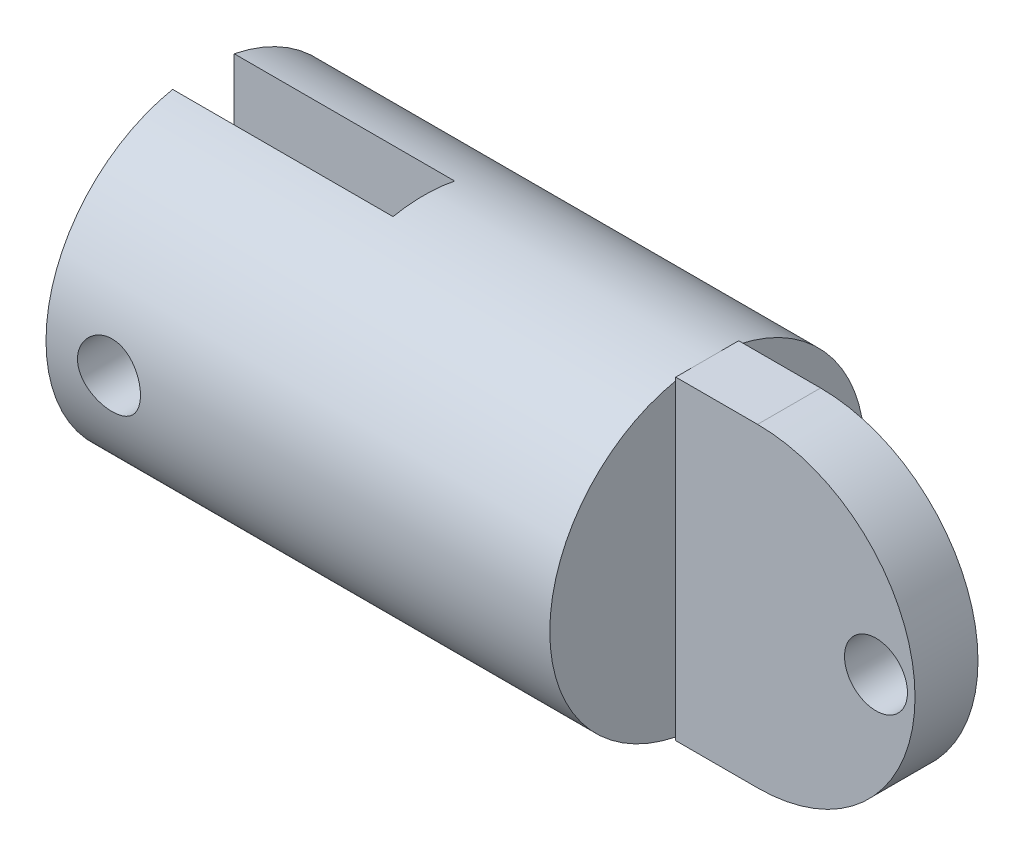
ISO-10303-21;
HEADER;
FILE_DESCRIPTION(('STEP AP214'),'2;1');
FILE_NAME('part.step','',(''),(''),'','','');
FILE_SCHEMA(('AUTOMOTIVE_DESIGN { 1 0 10303 214 1 1 1 1 }'));
ENDSEC;
DATA;
#1=APPLICATION_CONTEXT('core data for automotive mechanical design processes');
#2=APPLICATION_PROTOCOL_DEFINITION('international standard','automotive_design',2000,#1);
#3=PRODUCT_CONTEXT('',#1,'mechanical');
#4=PRODUCT('Part','Part','',(#3));
#5=PRODUCT_RELATED_PRODUCT_CATEGORY('part','',(#4));
#6=PRODUCT_DEFINITION_FORMATION('','',#4);
#7=PRODUCT_DEFINITION_CONTEXT('part definition',#1,'design');
#8=PRODUCT_DEFINITION('design','',#6,#7);
#9=PRODUCT_DEFINITION_SHAPE('','',#8);
#10=(LENGTH_UNIT() NAMED_UNIT(*) SI_UNIT(.MILLI.,.METRE.));
#11=(NAMED_UNIT(*) PLANE_ANGLE_UNIT() SI_UNIT($,.RADIAN.));
#12=(NAMED_UNIT(*) SI_UNIT($,.STERADIAN.) SOLID_ANGLE_UNIT());
#13=UNCERTAINTY_MEASURE_WITH_UNIT(LENGTH_MEASURE(1.E-05),#10,'distance_accuracy_value','');
#14=(GEOMETRIC_REPRESENTATION_CONTEXT(3) GLOBAL_UNCERTAINTY_ASSIGNED_CONTEXT((#13)) GLOBAL_UNIT_ASSIGNED_CONTEXT((#10,
#11,#12)) REPRESENTATION_CONTEXT('',''));
#15=CARTESIAN_POINT('',(0.,0.,0.));
#16=DIRECTION('',(0.,0.,1.));
#17=DIRECTION('',(1.,0.,0.));
#18=AXIS2_PLACEMENT_3D('',#15,#16,#17);
#19=CARTESIAN_POINT('',(-40.,0.,0.));
#20=DIRECTION('',(1.,0.,0.));
#21=DIRECTION('',(0.,0.,-1.));
#22=AXIS2_PLACEMENT_3D('',#19,#20,#21);
#23=PLANE('',#22);
#24=CARTESIAN_POINT('',(-40.,0.,0.));
#25=DIRECTION('',(1.,0.,0.));
#26=DIRECTION('',(0.,0.,-1.));
#27=AXIS2_PLACEMENT_3D('',#24,#25,#26);
#28=CIRCLE('',#27,12.5);
#29=CARTESIAN_POINT('',(-40.,12.2581864188566,2.44680725038947));
#30=VERTEX_POINT('',#29);
#31=CARTESIAN_POINT('',(-40.,-12.2581864188566,2.44680725038947));
#32=VERTEX_POINT('',#31);
#33=EDGE_CURVE('E154',#30,#32,#28,.T.);
#34=ORIENTED_EDGE('',*,*,#33,.F.);
#35=DIRECTION('',(0.,-1.,0.));
#36=VECTOR('',#35,1.);
#37=CARTESIAN_POINT('',(-40.,0.,2.44680725038947));
#38=LINE('',#37,#36);
#39=EDGE_CURVE('E143',#30,#32,#38,.T.);
#40=ORIENTED_EDGE('',*,*,#39,.T.);
#41=EDGE_LOOP('',(#34,#40));
#42=FACE_BOUND('',#41,.T.);
#43=ADVANCED_FACE('F50',(#42),#23,.F.);
#44=CARTESIAN_POINT('',(0.,0.,0.));
#45=DIRECTION('',(1.,0.,0.));
#46=DIRECTION('',(0.,0.,-1.));
#47=AXIS2_PLACEMENT_3D('',#44,#45,#46);
#48=PLANE('',#47);
#49=DIRECTION('',(0.,1.,0.));
#50=VECTOR('',#49,1.);
#51=CARTESIAN_POINT('',(0.,12.5,-2.5));
#52=LINE('',#51,#50);
#53=CARTESIAN_POINT('',(0.,-12.2474487139159,-2.5));
#54=VERTEX_POINT('',#53);
#55=CARTESIAN_POINT('',(0.,12.2474487139159,-2.5));
#56=VERTEX_POINT('',#55);
#57=EDGE_CURVE('E75',#54,#56,#52,.T.);
#58=ORIENTED_EDGE('',*,*,#57,.F.);
#59=CARTESIAN_POINT('',(0.,0.,0.));
#60=DIRECTION('',(1.,0.,0.));
#61=DIRECTION('',(0.,0.,-1.));
#62=AXIS2_PLACEMENT_3D('',#59,#60,#61);
#63=CIRCLE('',#62,12.5);
#64=EDGE_CURVE('E164',#54,#56,#63,.T.);
#65=ORIENTED_EDGE('',*,*,#64,.T.);
#66=EDGE_LOOP('',(#58,#65));
#67=FACE_BOUND('',#66,.T.);
#68=ADVANCED_FACE('F312',(#67),#48,.T.);
#69=CARTESIAN_POINT('',(-40.,0.,0.));
#70=DIRECTION('',(1.,0.,0.));
#71=DIRECTION('',(0.,0.,-1.));
#72=AXIS2_PLACEMENT_3D('',#69,#70,#71);
#73=CYLINDRICAL_SURFACE('',#72,12.5);
#74=CARTESIAN_POINT('',(-32.5,0.,-12.5));
#75=CARTESIAN_POINT('',(-32.5000051112459,-0.138942266981583,-12.4999974395218));
#76=CARTESIAN_POINT('',(-32.5116221074191,-0.277949150503806,-12.4976596294558));
#77=CARTESIAN_POINT('',(-32.5577462502881,-0.552033769222548,-12.4885591405808));
#78=CARTESIAN_POINT('',(-32.5922715820038,-0.687108293853389,-12.4817929465047));
#79=CARTESIAN_POINT('',(-32.683103184052,-0.949325763158283,-12.4645912319572));
#80=CARTESIAN_POINT('',(-32.7393885921117,-1.07647616983284,-12.454159226918));
#81=CARTESIAN_POINT('',(-32.8720806187782,-1.31951997216057,-12.4307599508829));
#82=CARTESIAN_POINT('',(-32.948486039018,-1.43541403768953,-12.4177928308927));
#83=CARTESIAN_POINT('',(-33.1203462357286,-1.65423369328716,-12.3905541332492));
#84=CARTESIAN_POINT('',(-33.216020888478,-1.75698487789631,-12.3762686376087));
#85=CARTESIAN_POINT('',(-33.4232310409793,-1.94509189152007,-12.3481045113147));
#86=CARTESIAN_POINT('',(-33.5347677783378,-2.03044636192606,-12.3342259125106));
#87=CARTESIAN_POINT('',(-33.7717904825297,-2.18207938336905,-12.3083110453154));
#88=CARTESIAN_POINT('',(-33.8973941094909,-2.24817734716467,-12.2962926841236));
#89=CARTESIAN_POINT('',(-34.1582045475102,-2.35826416645077,-12.2756567014604));
#90=CARTESIAN_POINT('',(-34.2934104083659,-2.4022552060931,-12.267038744049));
#91=CARTESIAN_POINT('',(-34.5677109097698,-2.46631324971207,-12.2543201313051));
#92=CARTESIAN_POINT('',(-34.7067313603556,-2.48668624489695,-12.2501617526797));
#93=CARTESIAN_POINT('',(-34.9862745534109,-2.5038803193153,-12.2466593765157));
#94=CARTESIAN_POINT('',(-35.1267971408004,-2.50070380678375,-12.247314886696));
#95=CARTESIAN_POINT('',(-35.4031169700525,-2.47113643275455,-12.2533137787046));
#96=CARTESIAN_POINT('',(-35.5389535140683,-2.44509635060976,-12.2585863214691));
#97=CARTESIAN_POINT('',(-35.8042901916575,-2.37109471155763,-12.273113654));
#98=CARTESIAN_POINT('',(-35.9337900222975,-2.3231321077517,-12.2823686339445));
#99=CARTESIAN_POINT('',(-36.183788154259,-2.2063119591868,-12.3038904625102));
#100=CARTESIAN_POINT('',(-36.3042196989229,-2.13731537808029,-12.3161772453426));
#101=CARTESIAN_POINT('',(-36.531927124932,-1.9804839364317,-12.3423654693265));
#102=CARTESIAN_POINT('',(-36.6392014921279,-1.89264691089207,-12.3562670959591));
#103=CARTESIAN_POINT('',(-36.8395735061423,-1.69874983640146,-12.3844255310365));
#104=CARTESIAN_POINT('',(-36.9323814196478,-1.59239040303111,-12.3986842302726));
#105=CARTESIAN_POINT('',(-37.0988846157531,-1.36546256015502,-12.4257212178602));
#106=CARTESIAN_POINT('',(-37.172579653234,-1.24489396844847,-12.4384994872243));
#107=CARTESIAN_POINT('',(-37.2988187730649,-0.992648467197301,-12.4611672540222));
#108=CARTESIAN_POINT('',(-37.3513297341113,-0.860954548963248,-12.4710522212068));
#109=CARTESIAN_POINT('',(-37.4334011850964,-0.590372441121661,-12.4867852246965));
#110=CARTESIAN_POINT('',(-37.4629644551841,-0.451485125181124,-12.4926337500133));
#111=CARTESIAN_POINT('',(-37.4978911344857,-0.172948514067878,-12.4995667966717));
#112=CARTESIAN_POINT('',(-37.5036510488507,-0.0333508208139418,-12.5007293663117));
#113=CARTESIAN_POINT('',(-37.4918753526446,0.244812335481785,-12.4983762982526));
#114=CARTESIAN_POINT('',(-37.4743410516185,0.383377856109483,-12.4948609235362));
#115=CARTESIAN_POINT('',(-37.4168040661401,0.654264149866351,-12.4835958002004));
#116=CARTESIAN_POINT('',(-37.3770048287552,0.786629870849755,-12.4758844101052));
#117=CARTESIAN_POINT('',(-37.2762900433605,1.04280906874917,-12.4570888015258));
#118=CARTESIAN_POINT('',(-37.2153729133079,1.16662190409385,-12.4460043303557));
#119=CARTESIAN_POINT('',(-37.0732937733717,1.40385293421554,-12.4214977883324));
#120=CARTESIAN_POINT('',(-36.9918930474026,1.51712531688047,-12.4080487609263));
#121=CARTESIAN_POINT('',(-36.8114770219818,1.72854504779802,-12.3803683707471));
#122=CARTESIAN_POINT('',(-36.7124598340003,1.82669077232691,-12.3661369242097));
#123=CARTESIAN_POINT('',(-36.4978166202722,2.00660147693544,-12.3382325889241));
#124=CARTESIAN_POINT('',(-36.3819606394467,2.08809425612164,-12.3245715058326));
#125=CARTESIAN_POINT('',(-36.1379715966083,2.23046355012802,-12.2996047949049));
#126=CARTESIAN_POINT('',(-36.0098390260661,2.29134088980726,-12.2882990728336));
#127=CARTESIAN_POINT('',(-35.7455793846261,2.3903796039549,-12.2694185146096));
#128=CARTESIAN_POINT('',(-35.6094978969742,2.42865874947763,-12.2618243718047));
#129=CARTESIAN_POINT('',(-35.3326663662727,2.48177162906799,-12.2511859198006));
#130=CARTESIAN_POINT('',(-35.1919169344766,2.49660842056278,-12.2481410172778));
#131=CARTESIAN_POINT('',(-34.9124778386392,2.50230227716867,-12.2469787407845));
#132=CARTESIAN_POINT('',(-34.7737971276825,2.49358947017724,-12.2487729797325));
#133=CARTESIAN_POINT('',(-34.4999208752374,2.45338076025015,-12.2568893371153));
#134=CARTESIAN_POINT('',(-34.364725305763,2.42188504032325,-12.2632114191792));
#135=CARTESIAN_POINT('',(-34.1019307218986,2.33719642124739,-12.279631605479));
#136=CARTESIAN_POINT('',(-33.974314098744,2.28405626679336,-12.2897205254708));
#137=CARTESIAN_POINT('',(-33.7297406981639,2.15763661150401,-12.3125428743543));
#138=CARTESIAN_POINT('',(-33.6127848156872,2.08435542193721,-12.3252765249723));
#139=CARTESIAN_POINT('',(-33.3907110696242,1.91826478696604,-12.3522240130806));
#140=CARTESIAN_POINT('',(-33.285828086831,1.82514471808795,-12.3664593227425));
#141=CARTESIAN_POINT('',(-33.0930344861771,1.62266092253285,-12.3946520467989));
#142=CARTESIAN_POINT('',(-33.0051277742068,1.51329346788334,-12.4086093965796));
#143=CARTESIAN_POINT('',(-32.8479133901339,1.28004407272062,-12.4348458096993));
#144=CARTESIAN_POINT('',(-32.7788099917999,1.15602221107459,-12.4471057804812));
#145=CARTESIAN_POINT('',(-32.6625346935085,0.897915902351834,-12.468378127125));
#146=CARTESIAN_POINT('',(-32.6153430261688,0.763840652157817,-12.4773934284654));
#147=CARTESIAN_POINT('',(-32.5533701298882,0.524553722309449,-12.4894093148843));
#148=CARTESIAN_POINT('',(-32.5333920157306,0.420704160034462,-12.4933575789613));
#149=CARTESIAN_POINT('',(-32.5067052191041,0.211248813025168,-12.4986538534973));
#150=CARTESIAN_POINT('',(-32.4999961137256,0.105643084371548,-12.5000019468289));
#151=CARTESIAN_POINT('',(-32.5,0.,-12.5));
#152=B_SPLINE_CURVE_WITH_KNOTS('',3,(#74,#75,#76,#77,#78,#79,#80,#81,#82,#83,#84,#85,#86,#87,
#88,#89,#90,#91,#92,#93,#94,#95,#96,#97,#98,#99,#100,#101,#102,#103,#104,#105,#106,#107,#108,
#109,#110,#111,#112,#113,#114,#115,#116,#117,#118,#119,#120,#121,#122,#123,#124,#125,#126,#127,
#128,#129,#130,#131,#132,#133,#134,#135,#136,#137,#138,#139,#140,#141,#142,#143,#144,#145,#146,
#147,#148,#149,#150,#151),.UNSPECIFIED.,.T.,.F.,(4,2,2,2,2,2,2,2,2,2,2,2,2,2,2,2,2,2,2,2,2,2,2,
2,2,2,2,2,2,2,2,2,2,2,2,2,2,2,4),(0.,0.416440326653146,0.833211626728308,1.24958433812585,
1.66593225557716,2.08733167528047,2.50876399186841,2.93402987514807,3.35925373412995,
3.77890462758969,4.19851260703064,4.61179317515697,5.02509348134325,5.44118725508982,
5.85732886874177,6.28095631228378,6.70458918849551,7.12888187135061,7.55312314245091,
7.97026839190664,8.3873901914467,8.80076134876809,9.21416348040057,9.63262665083397,
10.0511347086483,10.4760157144807,10.9008797180867,11.3235095258181,11.7460842082604,
12.1609930641925,12.5758985873152,12.9897990313278,13.4037341895467,13.8247019059786,
14.2457663633233,14.6712374168909,15.096323887938,15.4129693822474,15.7296047842749),.UNSPECIFIED.);
#153=CARTESIAN_POINT('',(-32.5,0.,-12.5));
#154=VERTEX_POINT('',#153);
#155=EDGE_CURVE('E186',#154,#154,#152,.T.);
#156=ORIENTED_EDGE('',*,*,#155,.F.);
#157=EDGE_LOOP('',(#156));
#158=FACE_BOUND('',#157,.T.);
#159=CARTESIAN_POINT('',(-32.5,0.,12.5));
#160=CARTESIAN_POINT('',(-32.5000051112459,0.138942266981583,12.4999974395218));
#161=CARTESIAN_POINT('',(-32.5116221074191,0.277949150503806,12.4976596294558));
#162=CARTESIAN_POINT('',(-32.5577462502881,0.552033769222548,12.4885591405808));
#163=CARTESIAN_POINT('',(-32.5922715820038,0.687108293853389,12.4817929465047));
#164=CARTESIAN_POINT('',(-32.683103184052,0.949325763158283,12.4645912319572));
#165=CARTESIAN_POINT('',(-32.7393885921117,1.07647616983284,12.454159226918));
#166=CARTESIAN_POINT('',(-32.8720806187782,1.31951997216057,12.4307599508829));
#167=CARTESIAN_POINT('',(-32.948486039018,1.43541403768953,12.4177928308927));
#168=CARTESIAN_POINT('',(-33.1203462357286,1.65423369328716,12.3905541332492));
#169=CARTESIAN_POINT('',(-33.216020888478,1.75698487789631,12.3762686376087));
#170=CARTESIAN_POINT('',(-33.4232310409793,1.94509189152007,12.3481045113147));
#171=CARTESIAN_POINT('',(-33.5347677783378,2.03044636192606,12.3342259125106));
#172=CARTESIAN_POINT('',(-33.7717904825297,2.18207938336905,12.3083110453154));
#173=CARTESIAN_POINT('',(-33.8973941094909,2.24817734716467,12.2962926841236));
#174=CARTESIAN_POINT('',(-34.1582045475102,2.35826416645077,12.2756567014604));
#175=CARTESIAN_POINT('',(-34.2934104083659,2.4022552060931,12.267038744049));
#176=CARTESIAN_POINT('',(-34.5677109097698,2.46631324971207,12.2543201313051));
#177=CARTESIAN_POINT('',(-34.7067313603556,2.48668624489695,12.2501617526797));
#178=CARTESIAN_POINT('',(-34.9862745534109,2.5038803193153,12.2466593765157));
#179=CARTESIAN_POINT('',(-35.1267971408004,2.50070380678375,12.247314886696));
#180=CARTESIAN_POINT('',(-35.4031169700525,2.47113643275455,12.2533137787046));
#181=CARTESIAN_POINT('',(-35.5389535140683,2.44509635060976,12.2585863214691));
#182=CARTESIAN_POINT('',(-35.8042901916575,2.37109471155763,12.273113654));
#183=CARTESIAN_POINT('',(-35.9337900222975,2.3231321077517,12.2823686339445));
#184=CARTESIAN_POINT('',(-36.183788154259,2.2063119591868,12.3038904625102));
#185=CARTESIAN_POINT('',(-36.3042196989229,2.13731537808029,12.3161772453426));
#186=CARTESIAN_POINT('',(-36.531927124932,1.9804839364317,12.3423654693265));
#187=CARTESIAN_POINT('',(-36.6392014921279,1.89264691089207,12.3562670959591));
#188=CARTESIAN_POINT('',(-36.8395735061423,1.69874983640146,12.3844255310365));
#189=CARTESIAN_POINT('',(-36.9323814196478,1.59239040303111,12.3986842302726));
#190=CARTESIAN_POINT('',(-37.0988846157531,1.36546256015502,12.4257212178602));
#191=CARTESIAN_POINT('',(-37.172579653234,1.24489396844847,12.4384994872243));
#192=CARTESIAN_POINT('',(-37.2988187730649,0.992648467197301,12.4611672540222));
#193=CARTESIAN_POINT('',(-37.3513297341113,0.860954548963248,12.4710522212068));
#194=CARTESIAN_POINT('',(-37.4334011850964,0.590372441121661,12.4867852246965));
#195=CARTESIAN_POINT('',(-37.4629644551841,0.451485125181124,12.4926337500133));
#196=CARTESIAN_POINT('',(-37.4978911344857,0.172948514067878,12.4995667966717));
#197=CARTESIAN_POINT('',(-37.5036510488507,0.0333508208139418,12.5007293663117));
#198=CARTESIAN_POINT('',(-37.4918753526446,-0.244812335481785,12.4983762982526));
#199=CARTESIAN_POINT('',(-37.4743410516185,-0.383377856109483,12.4948609235362));
#200=CARTESIAN_POINT('',(-37.4168040661401,-0.654264149866351,12.4835958002004));
#201=CARTESIAN_POINT('',(-37.3770048287552,-0.786629870849755,12.4758844101052));
#202=CARTESIAN_POINT('',(-37.2762900433605,-1.04280906874917,12.4570888015258));
#203=CARTESIAN_POINT('',(-37.2153729133079,-1.16662190409385,12.4460043303557));
#204=CARTESIAN_POINT('',(-37.0732937733717,-1.40385293421554,12.4214977883324));
#205=CARTESIAN_POINT('',(-36.9918930474026,-1.51712531688047,12.4080487609263));
#206=CARTESIAN_POINT('',(-36.8114770219818,-1.72854504779802,12.3803683707471));
#207=CARTESIAN_POINT('',(-36.7124598340003,-1.82669077232691,12.3661369242097));
#208=CARTESIAN_POINT('',(-36.4978166202722,-2.00660147693544,12.3382325889241));
#209=CARTESIAN_POINT('',(-36.3819606394467,-2.08809425612164,12.3245715058326));
#210=CARTESIAN_POINT('',(-36.1379715966083,-2.23046355012802,12.2996047949049));
#211=CARTESIAN_POINT('',(-36.0098390260661,-2.29134088980726,12.2882990728336));
#212=CARTESIAN_POINT('',(-35.7455793846261,-2.3903796039549,12.2694185146096));
#213=CARTESIAN_POINT('',(-35.6094978969742,-2.42865874947763,12.2618243718047));
#214=CARTESIAN_POINT('',(-35.3326663662727,-2.48177162906799,12.2511859198006));
#215=CARTESIAN_POINT('',(-35.1919169344766,-2.49660842056278,12.2481410172778));
#216=CARTESIAN_POINT('',(-34.9124778386392,-2.50230227716867,12.2469787407845));
#217=CARTESIAN_POINT('',(-34.7737971276825,-2.49358947017724,12.2487729797325));
#218=CARTESIAN_POINT('',(-34.4999208752374,-2.45338076025015,12.2568893371153));
#219=CARTESIAN_POINT('',(-34.364725305763,-2.42188504032325,12.2632114191792));
#220=CARTESIAN_POINT('',(-34.1019307218986,-2.33719642124739,12.279631605479));
#221=CARTESIAN_POINT('',(-33.974314098744,-2.28405626679336,12.2897205254708));
#222=CARTESIAN_POINT('',(-33.7297406981639,-2.15763661150401,12.3125428743543));
#223=CARTESIAN_POINT('',(-33.6127848156872,-2.08435542193721,12.3252765249723));
#224=CARTESIAN_POINT('',(-33.3907110696242,-1.91826478696604,12.3522240130806));
#225=CARTESIAN_POINT('',(-33.285828086831,-1.82514471808795,12.3664593227425));
#226=CARTESIAN_POINT('',(-33.0930344861771,-1.62266092253285,12.3946520467989));
#227=CARTESIAN_POINT('',(-33.0051277742068,-1.51329346788334,12.4086093965796));
#228=CARTESIAN_POINT('',(-32.8479133901339,-1.28004407272062,12.4348458096993));
#229=CARTESIAN_POINT('',(-32.7788099917999,-1.15602221107459,12.4471057804812));
#230=CARTESIAN_POINT('',(-32.6625346935085,-0.897915902351834,12.468378127125));
#231=CARTESIAN_POINT('',(-32.6153430261688,-0.763840652157817,12.4773934284654));
#232=CARTESIAN_POINT('',(-32.5533701298882,-0.524553722309449,12.4894093148843));
#233=CARTESIAN_POINT('',(-32.5333920157306,-0.420704160034462,12.4933575789613));
#234=CARTESIAN_POINT('',(-32.5067052191041,-0.211248813025168,12.4986538534973));
#235=CARTESIAN_POINT('',(-32.4999961137256,-0.105643084371548,12.5000019468289));
#236=CARTESIAN_POINT('',(-32.5,0.,12.5));
#237=B_SPLINE_CURVE_WITH_KNOTS('',3,(#159,#160,#161,#162,#163,#164,#165,#166,#167,#168,#169,
#170,#171,#172,#173,#174,#175,#176,#177,#178,#179,#180,#181,#182,#183,#184,#185,#186,#187,#188,
#189,#190,#191,#192,#193,#194,#195,#196,#197,#198,#199,#200,#201,#202,#203,#204,#205,#206,#207,
#208,#209,#210,#211,#212,#213,#214,#215,#216,#217,#218,#219,#220,#221,#222,#223,#224,#225,#226,
#227,#228,#229,#230,#231,#232,#233,#234,#235,#236),.UNSPECIFIED.,.T.,.F.,(4,2,2,2,2,2,2,2,2,2,2,
2,2,2,2,2,2,2,2,2,2,2,2,2,2,2,2,2,2,2,2,2,2,2,2,2,2,2,4),(0.,0.416440326653146,
0.833211626728308,1.24958433812585,1.66593225557716,2.08733167528047,2.50876399186841,
2.93402987514807,3.35925373412995,3.77890462758969,4.19851260703064,4.61179317515697,
5.02509348134325,5.44118725508982,5.85732886874177,6.28095631228378,6.70458918849551,
7.12888187135061,7.55312314245091,7.97026839190664,8.3873901914467,8.80076134876809,
9.21416348040057,9.63262665083397,10.0511347086483,10.4760157144807,10.9008797180867,
11.3235095258181,11.7460842082604,12.1609930641925,12.5758985873152,12.9897990313278,
13.4037341895467,13.8247019059786,14.2457663633233,14.6712374168909,15.096323887938,
15.4129693822474,15.7296047842749),.UNSPECIFIED.);
#238=CARTESIAN_POINT('',(-32.5,0.,12.5));
#239=VERTEX_POINT('',#238);
#240=EDGE_CURVE('E336',#239,#239,#237,.T.);
#241=ORIENTED_EDGE('',*,*,#240,.F.);
#242=EDGE_LOOP('',(#241));
#243=FACE_BOUND('',#242,.T.);
#244=DIRECTION('',(1.,0.,0.));
#245=VECTOR('',#244,1.);
#246=CARTESIAN_POINT('',(-40.,-12.2581864188566,2.44680725038947));
#247=LINE('',#246,#245);
#248=CARTESIAN_POINT('',(-22.5,-12.2581864188566,2.44680725038947));
#249=VERTEX_POINT('',#248);
#250=EDGE_CURVE('E173',#249,#32,#247,.F.);
#251=ORIENTED_EDGE('',*,*,#250,.F.);
#252=CARTESIAN_POINT('',(-22.5,0.,0.));
#253=DIRECTION('',(1.,0.,0.));
#254=DIRECTION('',(0.,0.,-1.));
#255=AXIS2_PLACEMENT_3D('',#252,#253,#254);
#256=CIRCLE('',#255,12.5);
#257=CARTESIAN_POINT('',(-22.5,-12.2581864188566,-2.44680725038947));
#258=VERTEX_POINT('',#257);
#259=EDGE_CURVE('E13',#258,#249,#256,.F.);
#260=ORIENTED_EDGE('',*,*,#259,.F.);
#261=DIRECTION('',(1.,0.,0.));
#262=VECTOR('',#261,1.);
#263=CARTESIAN_POINT('',(-40.,-12.2581864188566,-2.44680725038947));
#264=LINE('',#263,#262);
#265=CARTESIAN_POINT('',(-40.,-12.2581864188566,-2.44680725038947));
#266=VERTEX_POINT('',#265);
#267=EDGE_CURVE('E137',#266,#258,#264,.T.);
#268=ORIENTED_EDGE('',*,*,#267,.F.);
#269=CARTESIAN_POINT('',(-40.,12.2581864188566,-2.44680725038947));
#270=VERTEX_POINT('',#269);
#271=EDGE_CURVE('E148',#266,#270,#28,.T.);
#272=ORIENTED_EDGE('',*,*,#271,.T.);
#273=DIRECTION('',(1.,0.,0.));
#274=VECTOR('',#273,1.);
#275=CARTESIAN_POINT('',(-40.,12.2581864188566,-2.44680725038947));
#276=LINE('',#275,#274);
#277=CARTESIAN_POINT('',(-22.5,12.2581864188566,-2.44680725038947));
#278=VERTEX_POINT('',#277);
#279=EDGE_CURVE('E68',#278,#270,#276,.F.);
#280=ORIENTED_EDGE('',*,*,#279,.F.);
#281=CARTESIAN_POINT('',(-22.5,12.2581864188566,2.44680725038947));
#282=VERTEX_POINT('',#281);
#283=EDGE_CURVE('E61',#282,#278,#256,.F.);
#284=ORIENTED_EDGE('',*,*,#283,.F.);
#285=DIRECTION('',(1.,0.,0.));
#286=VECTOR('',#285,1.);
#287=CARTESIAN_POINT('',(-40.,12.2581864188566,2.44680725038947));
#288=LINE('',#287,#286);
#289=EDGE_CURVE('E189',#30,#282,#288,.T.);
#290=ORIENTED_EDGE('',*,*,#289,.F.);
#291=ORIENTED_EDGE('',*,*,#33,.T.);
#292=EDGE_LOOP('',(#251,#260,#268,#272,#280,#284,#290,#291));
#293=FACE_BOUND('',#292,.T.);
#294=CARTESIAN_POINT('',(0.,12.5,0.));
#295=VERTEX_POINT('',#294);
#296=EDGE_CURVE('E155',#56,#295,#63,.T.);
#297=ORIENTED_EDGE('',*,*,#296,.F.);
#298=ORIENTED_EDGE('',*,*,#64,.F.);
#299=CARTESIAN_POINT('',(0.,-12.5,0.));
#300=VERTEX_POINT('',#299);
#301=EDGE_CURVE('E253',#300,#54,#63,.T.);
#302=ORIENTED_EDGE('',*,*,#301,.F.);
#303=CARTESIAN_POINT('',(0.,-12.2474487139159,2.5));
#304=VERTEX_POINT('',#303);
#305=EDGE_CURVE('E257',#304,#300,#63,.T.);
#306=ORIENTED_EDGE('',*,*,#305,.F.);
#307=CARTESIAN_POINT('',(0.,12.2474487139159,2.5));
#308=VERTEX_POINT('',#307);
#309=EDGE_CURVE('E263',#308,#304,#63,.T.);
#310=ORIENTED_EDGE('',*,*,#309,.F.);
#311=EDGE_CURVE('E162',#295,#308,#63,.T.);
#312=ORIENTED_EDGE('',*,*,#311,.F.);
#313=EDGE_LOOP('',(#297,#298,#302,#306,#310,#312));
#314=FACE_BOUND('',#313,.T.);
#315=ADVANCED_FACE('F52',(#158,#243,#293,#314),#73,.T.);
#316=ORIENTED_EDGE('',*,*,#271,.F.);
#317=DIRECTION('',(0.,1.,0.));
#318=VECTOR('',#317,1.);
#319=CARTESIAN_POINT('',(-40.,0.,-2.44680725038947));
#320=LINE('',#319,#318);
#321=EDGE_CURVE('E134',#266,#270,#320,.T.);
#322=ORIENTED_EDGE('',*,*,#321,.T.);
#323=EDGE_LOOP('',(#316,#322));
#324=FACE_BOUND('',#323,.T.);
#325=ADVANCED_FACE('F152',(#324),#23,.F.);
#326=DIRECTION('',(0.,-1.,0.));
#327=VECTOR('',#326,1.);
#328=CARTESIAN_POINT('',(0.,12.5,2.5));
#329=LINE('',#328,#327);
#330=EDGE_CURVE('E160',#308,#304,#329,.T.);
#331=ORIENTED_EDGE('',*,*,#330,.F.);
#332=ORIENTED_EDGE('',*,*,#309,.T.);
#333=EDGE_LOOP('',(#331,#332));
#334=FACE_BOUND('',#333,.T.);
#335=ADVANCED_FACE('F309',(#334),#48,.T.);
#336=CARTESIAN_POINT('',(0.,0.,0.));
#337=DIRECTION('',(-1.,0.,0.));
#338=DIRECTION('',(0.,0.,1.));
#339=AXIS2_PLACEMENT_3D('',#336,#337,#338);
#340=PLANE('',#339);
#341=CARTESIAN_POINT('',(0.,12.5,-2.5));
#342=VERTEX_POINT('',#341);
#343=EDGE_CURVE('E233',#56,#342,#52,.T.);
#344=ORIENTED_EDGE('',*,*,#343,.F.);
#345=ORIENTED_EDGE('',*,*,#296,.T.);
#346=DIRECTION('',(0.,0.,1.));
#347=VECTOR('',#346,1.);
#348=CARTESIAN_POINT('',(0.,12.5,2.5));
#349=LINE('',#348,#347);
#350=EDGE_CURVE('E219',#342,#295,#349,.T.);
#351=ORIENTED_EDGE('',*,*,#350,.F.);
#352=EDGE_LOOP('',(#344,#345,#351));
#353=FACE_BOUND('',#352,.T.);
#354=ADVANCED_FACE('F289',(#353),#340,.T.);
#355=CARTESIAN_POINT('',(0.,12.5,2.5));
#356=VERTEX_POINT('',#355);
#357=EDGE_CURVE('E205',#295,#356,#349,.T.);
#358=ORIENTED_EDGE('',*,*,#357,.F.);
#359=ORIENTED_EDGE('',*,*,#311,.T.);
#360=EDGE_CURVE('E224',#356,#308,#329,.T.);
#361=ORIENTED_EDGE('',*,*,#360,.F.);
#362=EDGE_LOOP('',(#358,#359,#361));
#363=FACE_BOUND('',#362,.T.);
#364=ADVANCED_FACE('F275',(#363),#340,.T.);
#365=CARTESIAN_POINT('',(0.,-12.5,2.5));
#366=VERTEX_POINT('',#365);
#367=EDGE_CURVE('E223',#304,#366,#329,.T.);
#368=ORIENTED_EDGE('',*,*,#367,.F.);
#369=ORIENTED_EDGE('',*,*,#305,.T.);
#370=DIRECTION('',(0.,0.,-1.));
#371=VECTOR('',#370,1.);
#372=CARTESIAN_POINT('',(0.,-12.5,2.5));
#373=LINE('',#372,#371);
#374=EDGE_CURVE('E229',#366,#300,#373,.T.);
#375=ORIENTED_EDGE('',*,*,#374,.F.);
#376=EDGE_LOOP('',(#368,#369,#375));
#377=FACE_BOUND('',#376,.T.);
#378=ADVANCED_FACE('F290',(#377),#340,.T.);
#379=CARTESIAN_POINT('',(6.5,12.5,2.5));
#380=DIRECTION('',(0.,-1.,0.));
#381=DIRECTION('',(0.,0.,-1.));
#382=AXIS2_PLACEMENT_3D('',#379,#380,#381);
#383=PLANE('',#382);
#384=ORIENTED_EDGE('',*,*,#350,.T.);
#385=ORIENTED_EDGE('',*,*,#357,.T.);
#386=DIRECTION('',(-1.,0.,0.));
#387=VECTOR('',#386,1.);
#388=CARTESIAN_POINT('',(6.5,12.5,2.5));
#389=LINE('',#388,#387);
#390=CARTESIAN_POINT('',(6.5,12.5,2.5));
#391=VERTEX_POINT('',#390);
#392=EDGE_CURVE('E166',#391,#356,#389,.T.);
#393=ORIENTED_EDGE('',*,*,#392,.F.);
#394=DIRECTION('',(0.,0.,1.));
#395=VECTOR('',#394,1.);
#396=CARTESIAN_POINT('',(6.5,12.5,2.5));
#397=LINE('',#396,#395);
#398=CARTESIAN_POINT('',(6.5,12.5,-2.5));
#399=VERTEX_POINT('',#398);
#400=EDGE_CURVE('E209',#399,#391,#397,.T.);
#401=ORIENTED_EDGE('',*,*,#400,.F.);
#402=DIRECTION('',(-1.,0.,0.));
#403=VECTOR('',#402,1.);
#404=CARTESIAN_POINT('',(6.5,12.5,-2.5));
#405=LINE('',#404,#403);
#406=EDGE_CURVE('E218',#399,#342,#405,.T.);
#407=ORIENTED_EDGE('',*,*,#406,.T.);
#408=EDGE_LOOP('',(#384,#385,#393,#401,#407));
#409=FACE_BOUND('',#408,.T.);
#410=ADVANCED_FACE('F284',(#409),#383,.F.);
#411=CARTESIAN_POINT('',(6.5,12.5,2.5));
#412=DIRECTION('',(0.,0.,-1.));
#413=DIRECTION('',(0.,1.,0.));
#414=AXIS2_PLACEMENT_3D('',#411,#412,#413);
#415=PLANE('',#414);
#416=CARTESIAN_POINT('',(15.9,0.,2.5));
#417=DIRECTION('',(0.,0.,-1.));
#418=DIRECTION('',(0.,1.,0.));
#419=AXIS2_PLACEMENT_3D('',#416,#417,#418);
#420=CIRCLE('',#419,2.5);
#421=CARTESIAN_POINT('',(18.4,0.,2.5));
#422=VERTEX_POINT('',#421);
#423=EDGE_CURVE('E172',#422,#422,#420,.T.);
#424=ORIENTED_EDGE('',*,*,#423,.T.);
#425=EDGE_LOOP('',(#424));
#426=FACE_BOUND('',#425,.T.);
#427=ORIENTED_EDGE('',*,*,#360,.T.);
#428=ORIENTED_EDGE('',*,*,#330,.T.);
#429=ORIENTED_EDGE('',*,*,#367,.T.);
#430=DIRECTION('',(-1.,0.,0.));
#431=VECTOR('',#430,1.);
#432=CARTESIAN_POINT('',(6.5,-12.5,2.5));
#433=LINE('',#432,#431);
#434=CARTESIAN_POINT('',(6.5,-12.5,2.5));
#435=VERTEX_POINT('',#434);
#436=EDGE_CURVE('E243',#435,#366,#433,.T.);
#437=ORIENTED_EDGE('',*,*,#436,.F.);
#438=CARTESIAN_POINT('',(6.5,0.,2.5));
#439=DIRECTION('',(0.,0.,1.));
#440=DIRECTION('',(1.,0.,0.));
#441=AXIS2_PLACEMENT_3D('',#438,#439,#440);
#442=CIRCLE('',#441,12.5);
#443=EDGE_CURVE('E200',#435,#391,#442,.T.);
#444=ORIENTED_EDGE('',*,*,#443,.T.);
#445=ORIENTED_EDGE('',*,*,#392,.T.);
#446=EDGE_LOOP('',(#427,#428,#429,#437,#444,#445));
#447=FACE_BOUND('',#446,.T.);
#448=ADVANCED_FACE('F277',(#426,#447),#415,.F.);
#449=CARTESIAN_POINT('',(6.5,-12.5,2.5));
#450=DIRECTION('',(0.,1.,0.));
#451=DIRECTION('',(0.,0.,1.));
#452=AXIS2_PLACEMENT_3D('',#449,#450,#451);
#453=PLANE('',#452);
#454=ORIENTED_EDGE('',*,*,#374,.T.);
#455=CARTESIAN_POINT('',(0.,-12.5,-2.5));
#456=VERTEX_POINT('',#455);
#457=EDGE_CURVE('E228',#300,#456,#373,.T.);
#458=ORIENTED_EDGE('',*,*,#457,.T.);
#459=DIRECTION('',(-1.,0.,0.));
#460=VECTOR('',#459,1.);
#461=CARTESIAN_POINT('',(6.5,-12.5,-2.5));
#462=LINE('',#461,#460);
#463=CARTESIAN_POINT('',(6.5,-12.5,-2.5));
#464=VERTEX_POINT('',#463);
#465=EDGE_CURVE('E240',#464,#456,#462,.T.);
#466=ORIENTED_EDGE('',*,*,#465,.F.);
#467=DIRECTION('',(0.,0.,-1.));
#468=VECTOR('',#467,1.);
#469=CARTESIAN_POINT('',(6.5,-12.5,2.5));
#470=LINE('',#469,#468);
#471=EDGE_CURVE('E213',#435,#464,#470,.T.);
#472=ORIENTED_EDGE('',*,*,#471,.F.);
#473=ORIENTED_EDGE('',*,*,#436,.T.);
#474=EDGE_LOOP('',(#454,#458,#466,#472,#473));
#475=FACE_BOUND('',#474,.T.);
#476=ADVANCED_FACE('F291',(#475),#453,.F.);
#477=CARTESIAN_POINT('',(6.5,12.5,-2.5));
#478=DIRECTION('',(0.,0.,1.));
#479=DIRECTION('',(0.,-1.,0.));
#480=AXIS2_PLACEMENT_3D('',#477,#478,#479);
#481=PLANE('',#480);
#482=CARTESIAN_POINT('',(15.9,0.,-2.5));
#483=DIRECTION('',(0.,0.,1.));
#484=DIRECTION('',(0.,-1.,0.));
#485=AXIS2_PLACEMENT_3D('',#482,#483,#484);
#486=CIRCLE('',#485,2.5);
#487=CARTESIAN_POINT('',(18.4,0.,-2.5));
#488=VERTEX_POINT('',#487);
#489=EDGE_CURVE('E169',#488,#488,#486,.T.);
#490=ORIENTED_EDGE('',*,*,#489,.T.);
#491=EDGE_LOOP('',(#490));
#492=FACE_BOUND('',#491,.T.);
#493=EDGE_CURVE('E214',#456,#54,#52,.T.);
#494=ORIENTED_EDGE('',*,*,#493,.T.);
#495=ORIENTED_EDGE('',*,*,#57,.T.);
#496=ORIENTED_EDGE('',*,*,#343,.T.);
#497=ORIENTED_EDGE('',*,*,#406,.F.);
#498=CARTESIAN_POINT('',(6.5,0.,-2.5));
#499=DIRECTION('',(0.,0.,1.));
#500=DIRECTION('',(1.,0.,0.));
#501=AXIS2_PLACEMENT_3D('',#498,#499,#500);
#502=CIRCLE('',#501,12.5);
#503=EDGE_CURVE('E201',#464,#399,#502,.T.);
#504=ORIENTED_EDGE('',*,*,#503,.F.);
#505=ORIENTED_EDGE('',*,*,#465,.T.);
#506=EDGE_LOOP('',(#494,#495,#496,#497,#504,#505));
#507=FACE_BOUND('',#506,.T.);
#508=ADVANCED_FACE('F294',(#492,#507),#481,.F.);
#509=ORIENTED_EDGE('',*,*,#457,.F.);
#510=ORIENTED_EDGE('',*,*,#301,.T.);
#511=ORIENTED_EDGE('',*,*,#493,.F.);
#512=EDGE_LOOP('',(#509,#510,#511));
#513=FACE_BOUND('',#512,.T.);
#514=ADVANCED_FACE('F295',(#513),#340,.T.);
#515=CARTESIAN_POINT('',(6.5,0.,-2.5));
#516=DIRECTION('',(0.,0.,1.));
#517=DIRECTION('',(1.,0.,0.));
#518=AXIS2_PLACEMENT_3D('',#515,#516,#517);
#519=CYLINDRICAL_SURFACE('',#518,12.5);
#520=ORIENTED_EDGE('',*,*,#443,.F.);
#521=ORIENTED_EDGE('',*,*,#471,.T.);
#522=ORIENTED_EDGE('',*,*,#503,.T.);
#523=ORIENTED_EDGE('',*,*,#400,.T.);
#524=EDGE_LOOP('',(#520,#521,#522,#523));
#525=FACE_BOUND('',#524,.T.);
#526=ADVANCED_FACE('F297',(#525),#519,.T.);
#527=CARTESIAN_POINT('',(15.9,0.,-12.5));
#528=DIRECTION('',(0.,0.,1.));
#529=DIRECTION('',(1.,0.,0.));
#530=AXIS2_PLACEMENT_3D('',#527,#528,#529);
#531=CYLINDRICAL_SURFACE('',#530,2.5);
#532=CARTESIAN_POINT('',(18.4,0.,-2.5));
#533=CARTESIAN_POINT('',(18.4,0.,-2.44791666666667));
#534=CARTESIAN_POINT('',(18.4,0.,-2.39583333333334));
#535=CARTESIAN_POINT('',(18.4,0.,-2.29166666666667));
#536=CARTESIAN_POINT('',(18.4,0.,-2.23958333333334));
#537=CARTESIAN_POINT('',(18.4,0.,-2.13541666666667));
#538=CARTESIAN_POINT('',(18.4,0.,-2.08333333333334));
#539=CARTESIAN_POINT('',(18.4,0.,-1.97916666666667));
#540=CARTESIAN_POINT('',(18.4,0.,-1.92708333333334));
#541=CARTESIAN_POINT('',(18.4,0.,-1.82291666666667));
#542=CARTESIAN_POINT('',(18.4,0.,-1.77083333333334));
#543=CARTESIAN_POINT('',(18.4,0.,-1.66666666666667));
#544=CARTESIAN_POINT('',(18.4,0.,-1.61458333333333));
#545=CARTESIAN_POINT('',(18.4,0.,-1.51041666666667));
#546=CARTESIAN_POINT('',(18.4,0.,-1.45833333333333));
#547=CARTESIAN_POINT('',(18.4,0.,-1.35416666666667));
#548=CARTESIAN_POINT('',(18.4,0.,-1.30208333333333));
#549=CARTESIAN_POINT('',(18.4,0.,-1.19791666666667));
#550=CARTESIAN_POINT('',(18.4,0.,-1.14583333333333));
#551=CARTESIAN_POINT('',(18.4,0.,-1.04166666666667));
#552=CARTESIAN_POINT('',(18.4,0.,-0.989583333333334));
#553=CARTESIAN_POINT('',(18.4,0.,-0.885416666666668));
#554=CARTESIAN_POINT('',(18.4,0.,-0.833333333333334));
#555=CARTESIAN_POINT('',(18.4,0.,-0.729166666666667));
#556=CARTESIAN_POINT('',(18.4,0.,-0.677083333333334));
#557=CARTESIAN_POINT('',(18.4,0.,-0.572916666666667));
#558=CARTESIAN_POINT('',(18.4,0.,-0.520833333333334));
#559=CARTESIAN_POINT('',(18.4,0.,-0.416666666666667));
#560=CARTESIAN_POINT('',(18.4,0.,-0.364583333333334));
#561=CARTESIAN_POINT('',(18.4,0.,-0.260416666666667));
#562=CARTESIAN_POINT('',(18.4,0.,-0.208333333333334));
#563=CARTESIAN_POINT('',(18.4,0.,-0.104166666666667));
#564=CARTESIAN_POINT('',(18.4,0.,-0.0520833333333334));
#565=CARTESIAN_POINT('',(18.4,0.,0.0520833333333334));
#566=CARTESIAN_POINT('',(18.4,0.,0.104166666666667));
#567=CARTESIAN_POINT('',(18.4,0.,0.208333333333334));
#568=CARTESIAN_POINT('',(18.4,0.,0.260416666666667));
#569=CARTESIAN_POINT('',(18.4,0.,0.364583333333334));
#570=CARTESIAN_POINT('',(18.4,0.,0.416666666666667));
#571=CARTESIAN_POINT('',(18.4,0.,0.520833333333334));
#572=CARTESIAN_POINT('',(18.4,0.,0.572916666666667));
#573=CARTESIAN_POINT('',(18.4,0.,0.677083333333334));
#574=CARTESIAN_POINT('',(18.4,0.,0.729166666666667));
#575=CARTESIAN_POINT('',(18.4,0.,0.833333333333334));
#576=CARTESIAN_POINT('',(18.4,0.,0.885416666666668));
#577=CARTESIAN_POINT('',(18.4,0.,0.989583333333334));
#578=CARTESIAN_POINT('',(18.4,0.,1.04166666666667));
#579=CARTESIAN_POINT('',(18.4,0.,1.14583333333333));
#580=CARTESIAN_POINT('',(18.4,0.,1.19791666666667));
#581=CARTESIAN_POINT('',(18.4,0.,1.30208333333333));
#582=CARTESIAN_POINT('',(18.4,0.,1.35416666666667));
#583=CARTESIAN_POINT('',(18.4,0.,1.45833333333333));
#584=CARTESIAN_POINT('',(18.4,0.,1.51041666666667));
#585=CARTESIAN_POINT('',(18.4,0.,1.61458333333333));
#586=CARTESIAN_POINT('',(18.4,0.,1.66666666666667));
#587=CARTESIAN_POINT('',(18.4,0.,1.77083333333334));
#588=CARTESIAN_POINT('',(18.4,0.,1.82291666666667));
#589=CARTESIAN_POINT('',(18.4,0.,1.92708333333334));
#590=CARTESIAN_POINT('',(18.4,0.,1.97916666666667));
#591=CARTESIAN_POINT('',(18.4,0.,2.08333333333334));
#592=CARTESIAN_POINT('',(18.4,0.,2.13541666666667));
#593=CARTESIAN_POINT('',(18.4,0.,2.23958333333334));
#594=CARTESIAN_POINT('',(18.4,0.,2.29166666666667));
#595=CARTESIAN_POINT('',(18.4,0.,2.39583333333334));
#596=CARTESIAN_POINT('',(18.4,0.,2.44791666666667));
#597=CARTESIAN_POINT('',(18.4,0.,2.5));
#598=B_SPLINE_CURVE_WITH_KNOTS('',3,(#532,#533,#534,#535,#536,#537,#538,#539,#540,#541,#542,
#543,#544,#545,#546,#547,#548,#549,#550,#551,#552,#553,#554,#555,#556,#557,#558,#559,#560,#561,
#562,#563,#564,#565,#566,#567,#568,#569,#570,#571,#572,#573,#574,#575,#576,#577,#578,#579,#580,
#581,#582,#583,#584,#585,#586,#587,#588,#589,#590,#591,#592,#593,#594,#595,#596,#597),
.UNSPECIFIED.,.F.,.F.,(4,2,2,2,2,2,2,2,2,2,2,2,2,2,2,2,2,2,2,2,2,2,2,2,2,2,2,2,2,2,2,2,4),(0.,
0.15625,0.3125,0.46875,0.625000000000001,0.781250000000001,0.937500000000001,1.09375,1.25,
1.40625,1.5625,1.71875,1.875,2.03125,2.1875,2.34375,2.5,2.65625,2.8125,2.96875,3.125,3.28125,
3.4375,3.59375,3.75,3.90625,4.0625,4.21875,4.375,4.53125,4.6875,4.84375,5.),.UNSPECIFIED.);
#599=EDGE_CURVE('BSEAM303',#488,#422,#598,.T.);
#600=ORIENTED_EDGE('',*,*,#489,.F.);
#601=ORIENTED_EDGE('',*,*,#423,.F.);
#602=ORIENTED_EDGE('',*,*,#599,.T.);
#603=ORIENTED_EDGE('',*,*,#599,.F.);
#604=EDGE_LOOP('',(#600,#602,#601,#603));
#605=FACE_BOUND('',#604,.T.);
#606=ADVANCED_FACE('F303',(#605),#531,.F.);
#607=CARTESIAN_POINT('',(-22.5,12.5,2.44680725038947));
#608=DIRECTION('',(0.,0.,1.));
#609=DIRECTION('',(1.,0.,0.));
#610=AXIS2_PLACEMENT_3D('',#607,#608,#609);
#611=PLANE('',#610);
#612=CARTESIAN_POINT('',(-35.,0.,2.44680725038948));
#613=DIRECTION('',(0.,0.,1.));
#614=DIRECTION('',(1.,0.,0.));
#615=AXIS2_PLACEMENT_3D('',#612,#613,#614);
#616=CIRCLE('',#615,2.5);
#617=CARTESIAN_POINT('',(-32.5,0.,2.44680725038948));
#618=VERTEX_POINT('',#617);
#619=EDGE_CURVE('E339',#618,#618,#616,.T.);
#620=ORIENTED_EDGE('',*,*,#619,.T.);
#621=EDGE_LOOP('',(#620));
#622=FACE_BOUND('',#621,.T.);
#623=ORIENTED_EDGE('',*,*,#250,.T.);
#624=ORIENTED_EDGE('',*,*,#39,.F.);
#625=ORIENTED_EDGE('',*,*,#289,.T.);
#626=DIRECTION('',(0.,1.,0.));
#627=VECTOR('',#626,1.);
#628=CARTESIAN_POINT('',(-22.5,12.5,2.44680725038947));
#629=LINE('',#628,#627);
#630=EDGE_CURVE('E150',#249,#282,#629,.T.);
#631=ORIENTED_EDGE('',*,*,#630,.F.);
#632=EDGE_LOOP('',(#623,#624,#625,#631));
#633=FACE_BOUND('',#632,.T.);
#634=ADVANCED_FACE('F361',(#622,#633),#611,.F.);
#635=CARTESIAN_POINT('',(-22.5,12.5,-2.44680725038947));
#636=DIRECTION('',(0.,0.,-1.));
#637=DIRECTION('',(-1.,0.,0.));
#638=AXIS2_PLACEMENT_3D('',#635,#636,#637);
#639=PLANE('',#638);
#640=CARTESIAN_POINT('',(-35.,0.,-2.44680725038948));
#641=DIRECTION('',(0.,0.,-1.));
#642=DIRECTION('',(-1.,0.,0.));
#643=AXIS2_PLACEMENT_3D('',#640,#641,#642);
#644=CIRCLE('',#643,2.5);
#645=CARTESIAN_POINT('',(-37.5,0.,-2.44680725038948));
#646=VERTEX_POINT('',#645);
#647=EDGE_CURVE('E55',#646,#646,#644,.T.);
#648=ORIENTED_EDGE('',*,*,#647,.T.);
#649=EDGE_LOOP('',(#648));
#650=FACE_BOUND('',#649,.T.);
#651=ORIENTED_EDGE('',*,*,#279,.T.);
#652=ORIENTED_EDGE('',*,*,#321,.F.);
#653=ORIENTED_EDGE('',*,*,#267,.T.);
#654=DIRECTION('',(0.,-1.,0.));
#655=VECTOR('',#654,1.);
#656=CARTESIAN_POINT('',(-22.5,12.5,-2.44680725038947));
#657=LINE('',#656,#655);
#658=EDGE_CURVE('E181',#278,#258,#657,.T.);
#659=ORIENTED_EDGE('',*,*,#658,.F.);
#660=EDGE_LOOP('',(#651,#652,#653,#659));
#661=FACE_BOUND('',#660,.T.);
#662=ADVANCED_FACE('F136',(#650,#661),#639,.F.);
#663=CARTESIAN_POINT('',(-22.5,0.,0.));
#664=DIRECTION('',(1.,0.,0.));
#665=DIRECTION('',(0.,0.,-1.));
#666=AXIS2_PLACEMENT_3D('',#663,#664,#665);
#667=PLANE('',#666);
#668=ORIENTED_EDGE('',*,*,#658,.T.);
#669=ORIENTED_EDGE('',*,*,#259,.T.);
#670=ORIENTED_EDGE('',*,*,#630,.T.);
#671=ORIENTED_EDGE('',*,*,#283,.T.);
#672=EDGE_LOOP('',(#668,#669,#670,#671));
#673=FACE_BOUND('',#672,.T.);
#674=ADVANCED_FACE('F180',(#673),#667,.F.);
#675=CARTESIAN_POINT('',(-35.,0.,-12.5));
#676=DIRECTION('',(0.,0.,1.));
#677=DIRECTION('',(1.,0.,0.));
#678=AXIS2_PLACEMENT_3D('',#675,#676,#677);
#679=CYLINDRICAL_SURFACE('',#678,2.5);
#680=ORIENTED_EDGE('',*,*,#155,.T.);
#681=EDGE_LOOP('',(#680));
#682=FACE_BOUND('',#681,.T.);
#683=ORIENTED_EDGE('',*,*,#647,.F.);
#684=EDGE_LOOP('',(#683));
#685=FACE_BOUND('',#684,.T.);
#686=ADVANCED_FACE('F357',(#682,#685),#679,.F.);
#687=ORIENTED_EDGE('',*,*,#240,.T.);
#688=EDGE_LOOP('',(#687));
#689=FACE_BOUND('',#688,.T.);
#690=ORIENTED_EDGE('',*,*,#619,.F.);
#691=EDGE_LOOP('',(#690));
#692=FACE_BOUND('',#691,.T.);
#693=ADVANCED_FACE('F353',(#689,#692),#679,.F.);
#694=CLOSED_SHELL('',(#43,#68,#315,#325,#335,#354,#364,#378,#410,#448,#476,#508,#514,#526,#606,
#634,#662,#674,#686,#693));
#695=MANIFOLD_SOLID_BREP('B2',#694);
#696=ADVANCED_BREP_SHAPE_REPRESENTATION('',(#18,#695),#14);
#697=SHAPE_DEFINITION_REPRESENTATION(#9,#696);
ENDSEC;
END-ISO-10303-21;
